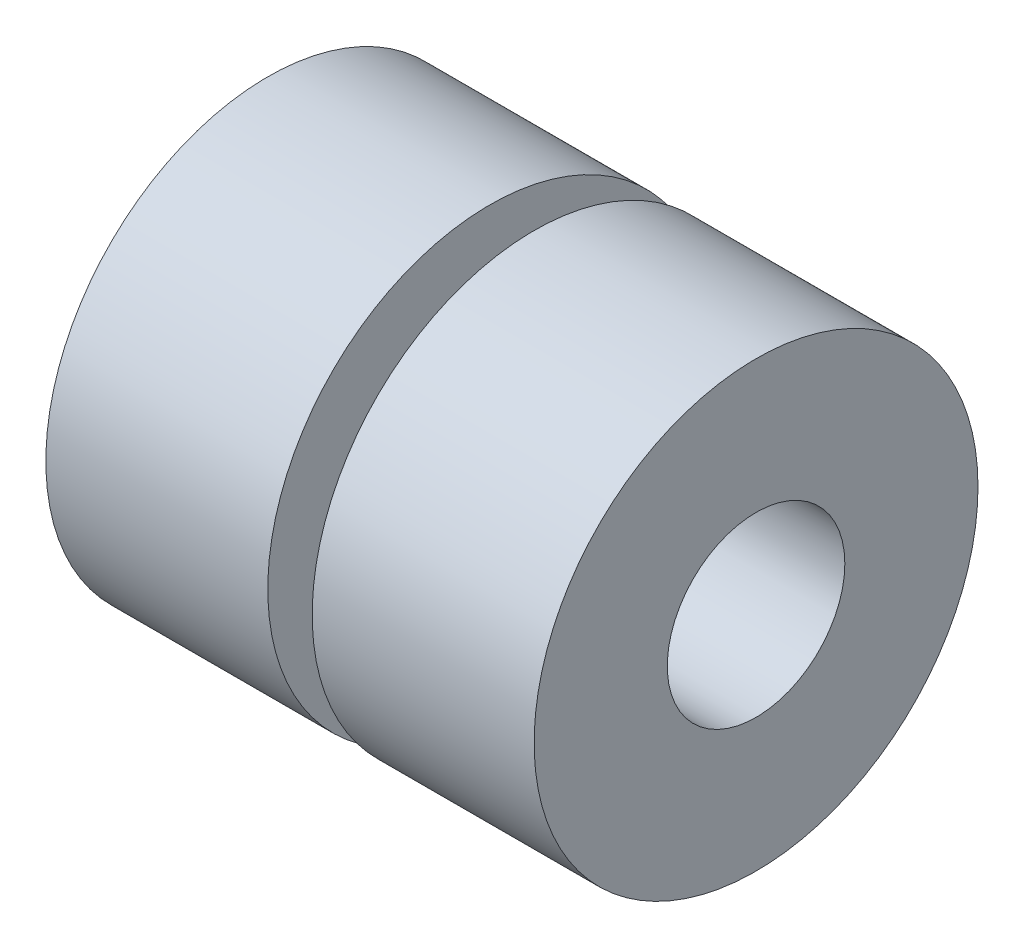
ISO-10303-21;
HEADER;
FILE_DESCRIPTION(('STEP AP214'),'2;1');
FILE_NAME('part.step','',(''),(''),'','','');
FILE_SCHEMA(('AUTOMOTIVE_DESIGN { 1 0 10303 214 1 1 1 1 }'));
ENDSEC;
DATA;
#1=APPLICATION_CONTEXT('core data for automotive mechanical design processes');
#2=APPLICATION_PROTOCOL_DEFINITION('international standard','automotive_design',2000,#1);
#3=PRODUCT_CONTEXT('',#1,'mechanical');
#4=PRODUCT('Part','Part','',(#3));
#5=PRODUCT_RELATED_PRODUCT_CATEGORY('part','',(#4));
#6=PRODUCT_DEFINITION_FORMATION('','',#4);
#7=PRODUCT_DEFINITION_CONTEXT('part definition',#1,'design');
#8=PRODUCT_DEFINITION('design','',#6,#7);
#9=PRODUCT_DEFINITION_SHAPE('','',#8);
#10=(LENGTH_UNIT() NAMED_UNIT(*) SI_UNIT(.MILLI.,.METRE.));
#11=(NAMED_UNIT(*) PLANE_ANGLE_UNIT() SI_UNIT($,.RADIAN.));
#12=(NAMED_UNIT(*) SI_UNIT($,.STERADIAN.) SOLID_ANGLE_UNIT());
#13=UNCERTAINTY_MEASURE_WITH_UNIT(LENGTH_MEASURE(1.E-05),#10,'distance_accuracy_value','');
#14=(GEOMETRIC_REPRESENTATION_CONTEXT(3) GLOBAL_UNCERTAINTY_ASSIGNED_CONTEXT((#13)) GLOBAL_UNIT_ASSIGNED_CONTEXT((#10,
#11,#12)) REPRESENTATION_CONTEXT('',''));
#15=CARTESIAN_POINT('',(0.,0.,0.));
#16=DIRECTION('',(0.,0.,1.));
#17=DIRECTION('',(1.,0.,0.));
#18=AXIS2_PLACEMENT_3D('',#15,#16,#17);
#19=CARTESIAN_POINT('',(5.,0.,0.));
#20=DIRECTION('',(-1.,0.,0.));
#21=DIRECTION('',(0.,0.,1.));
#22=AXIS2_PLACEMENT_3D('',#19,#20,#21);
#23=CYLINDRICAL_SURFACE('',#22,5.);
#24=CARTESIAN_POINT('',(5.,0.,0.));
#25=DIRECTION('',(1.,0.,0.));
#26=DIRECTION('',(0.,0.,-1.));
#27=AXIS2_PLACEMENT_3D('',#24,#25,#26);
#28=CIRCLE('',#27,5.);
#29=CARTESIAN_POINT('',(5.,0.,-5.));
#30=VERTEX_POINT('',#29);
#31=EDGE_CURVE('E10',#30,#30,#28,.T.);
#32=ORIENTED_EDGE('',*,*,#31,.F.);
#33=EDGE_LOOP('',(#32));
#34=FACE_BOUND('',#33,.T.);
#35=CARTESIAN_POINT('',(0.,0.,0.));
#36=DIRECTION('',(1.,0.,0.));
#37=DIRECTION('',(0.,0.,-1.));
#38=AXIS2_PLACEMENT_3D('',#35,#36,#37);
#39=CIRCLE('',#38,5.);
#40=CARTESIAN_POINT('',(0.,0.,-5.));
#41=VERTEX_POINT('',#40);
#42=EDGE_CURVE('E33',#41,#41,#39,.T.);
#43=ORIENTED_EDGE('',*,*,#42,.T.);
#44=EDGE_LOOP('',(#43));
#45=FACE_BOUND('',#44,.T.);
#46=ADVANCED_FACE('F30',(#34,#45),#23,.T.);
#47=CARTESIAN_POINT('',(5.,0.,0.));
#48=DIRECTION('',(1.,0.,0.));
#49=DIRECTION('',(0.,0.,-1.));
#50=AXIS2_PLACEMENT_3D('',#47,#48,#49);
#51=PLANE('',#50);
#52=CARTESIAN_POINT('',(5.,0.,0.));
#53=DIRECTION('',(1.,0.,0.));
#54=DIRECTION('',(0.,0.,-1.));
#55=AXIS2_PLACEMENT_3D('',#52,#53,#54);
#56=CIRCLE('',#55,2.5);
#57=CARTESIAN_POINT('',(5.,0.,-2.5));
#58=VERTEX_POINT('',#57);
#59=EDGE_CURVE('E42',#58,#58,#56,.T.);
#60=ORIENTED_EDGE('',*,*,#59,.F.);
#61=EDGE_LOOP('',(#60));
#62=FACE_BOUND('',#61,.T.);
#63=ORIENTED_EDGE('',*,*,#31,.T.);
#64=EDGE_LOOP('',(#63));
#65=FACE_BOUND('',#64,.T.);
#66=ADVANCED_FACE('F85',(#62,#65),#51,.T.);
#67=CARTESIAN_POINT('',(0.,0.,0.));
#68=DIRECTION('',(1.,0.,0.));
#69=DIRECTION('',(0.,0.,-1.));
#70=AXIS2_PLACEMENT_3D('',#67,#68,#69);
#71=PLANE('',#70);
#72=CARTESIAN_POINT('',(0.,0.,0.));
#73=DIRECTION('',(1.,0.,0.));
#74=DIRECTION('',(0.,0.,-1.));
#75=AXIS2_PLACEMENT_3D('',#72,#73,#74);
#76=CIRCLE('',#75,2.);
#77=CARTESIAN_POINT('',(0.,0.,-2.));
#78=VERTEX_POINT('',#77);
#79=EDGE_CURVE('E51',#78,#78,#76,.T.);
#80=ORIENTED_EDGE('',*,*,#79,.T.);
#81=EDGE_LOOP('',(#80));
#82=FACE_BOUND('',#81,.T.);
#83=ORIENTED_EDGE('',*,*,#42,.F.);
#84=EDGE_LOOP('',(#83));
#85=FACE_BOUND('',#84,.T.);
#86=ADVANCED_FACE('F90',(#82,#85),#71,.F.);
#87=CARTESIAN_POINT('',(6.,0.,0.));
#88=DIRECTION('',(-1.,0.,0.));
#89=DIRECTION('',(0.,0.,1.));
#90=AXIS2_PLACEMENT_3D('',#87,#88,#89);
#91=CYLINDRICAL_SURFACE('',#90,2.5);
#92=CARTESIAN_POINT('',(6.,0.,0.));
#93=DIRECTION('',(1.,0.,0.));
#94=DIRECTION('',(0.,0.,-1.));
#95=AXIS2_PLACEMENT_3D('',#92,#93,#94);
#96=CIRCLE('',#95,2.5);
#97=CARTESIAN_POINT('',(6.,0.,-2.5));
#98=VERTEX_POINT('',#97);
#99=EDGE_CURVE('E40',#98,#98,#96,.T.);
#100=ORIENTED_EDGE('',*,*,#99,.F.);
#101=EDGE_LOOP('',(#100));
#102=FACE_BOUND('',#101,.T.);
#103=ORIENTED_EDGE('',*,*,#59,.T.);
#104=EDGE_LOOP('',(#103));
#105=FACE_BOUND('',#104,.T.);
#106=ADVANCED_FACE('F73',(#102,#105),#91,.T.);
#107=CARTESIAN_POINT('',(11.,0.,0.));
#108=DIRECTION('',(-1.,0.,0.));
#109=DIRECTION('',(0.,0.,1.));
#110=AXIS2_PLACEMENT_3D('',#107,#108,#109);
#111=CYLINDRICAL_SURFACE('',#110,5.);
#112=CARTESIAN_POINT('',(11.,0.,0.));
#113=DIRECTION('',(1.,0.,0.));
#114=DIRECTION('',(0.,0.,-1.));
#115=AXIS2_PLACEMENT_3D('',#112,#113,#114);
#116=CIRCLE('',#115,5.);
#117=CARTESIAN_POINT('',(11.,0.,-5.));
#118=VERTEX_POINT('',#117);
#119=EDGE_CURVE('E45',#118,#118,#116,.T.);
#120=ORIENTED_EDGE('',*,*,#119,.F.);
#121=EDGE_LOOP('',(#120));
#122=FACE_BOUND('',#121,.T.);
#123=CARTESIAN_POINT('',(6.,0.,0.));
#124=DIRECTION('',(1.,0.,0.));
#125=DIRECTION('',(0.,0.,-1.));
#126=AXIS2_PLACEMENT_3D('',#123,#124,#125);
#127=CIRCLE('',#126,5.);
#128=CARTESIAN_POINT('',(6.,0.,-5.));
#129=VERTEX_POINT('',#128);
#130=EDGE_CURVE('E48',#129,#129,#127,.T.);
#131=ORIENTED_EDGE('',*,*,#130,.T.);
#132=EDGE_LOOP('',(#131));
#133=FACE_BOUND('',#132,.T.);
#134=ADVANCED_FACE('F67',(#122,#133),#111,.T.);
#135=CARTESIAN_POINT('',(11.,0.,0.));
#136=DIRECTION('',(1.,0.,0.));
#137=DIRECTION('',(0.,0.,-1.));
#138=AXIS2_PLACEMENT_3D('',#135,#136,#137);
#139=PLANE('',#138);
#140=CARTESIAN_POINT('',(11.,0.,0.));
#141=DIRECTION('',(1.,0.,0.));
#142=DIRECTION('',(0.,0.,-1.));
#143=AXIS2_PLACEMENT_3D('',#140,#141,#142);
#144=CIRCLE('',#143,2.);
#145=CARTESIAN_POINT('',(11.,0.,-2.));
#146=VERTEX_POINT('',#145);
#147=EDGE_CURVE('E56',#146,#146,#144,.T.);
#148=ORIENTED_EDGE('',*,*,#147,.F.);
#149=EDGE_LOOP('',(#148));
#150=FACE_BOUND('',#149,.T.);
#151=ORIENTED_EDGE('',*,*,#119,.T.);
#152=EDGE_LOOP('',(#151));
#153=FACE_BOUND('',#152,.T.);
#154=ADVANCED_FACE('F63',(#150,#153),#139,.T.);
#155=CARTESIAN_POINT('',(6.,0.,0.));
#156=DIRECTION('',(1.,0.,0.));
#157=DIRECTION('',(0.,0.,-1.));
#158=AXIS2_PLACEMENT_3D('',#155,#156,#157);
#159=PLANE('',#158);
#160=ORIENTED_EDGE('',*,*,#99,.T.);
#161=EDGE_LOOP('',(#160));
#162=FACE_BOUND('',#161,.T.);
#163=ORIENTED_EDGE('',*,*,#130,.F.);
#164=EDGE_LOOP('',(#163));
#165=FACE_BOUND('',#164,.T.);
#166=ADVANCED_FACE('F66',(#162,#165),#159,.F.);
#167=CARTESIAN_POINT('',(-5.,0.,0.));
#168=DIRECTION('',(1.,0.,0.));
#169=DIRECTION('',(0.,0.,-1.));
#170=AXIS2_PLACEMENT_3D('',#167,#168,#169);
#171=CYLINDRICAL_SURFACE('',#170,2.);
#172=ORIENTED_EDGE('',*,*,#147,.T.);
#173=EDGE_LOOP('',(#172));
#174=FACE_BOUND('',#173,.T.);
#175=ORIENTED_EDGE('',*,*,#79,.F.);
#176=EDGE_LOOP('',(#175));
#177=FACE_BOUND('',#176,.T.);
#178=ADVANCED_FACE('F60',(#174,#177),#171,.F.);
#179=CLOSED_SHELL('',(#46,#66,#86,#106,#134,#154,#166,#178));
#180=MANIFOLD_SOLID_BREP('B2',#179);
#181=ADVANCED_BREP_SHAPE_REPRESENTATION('',(#18,#180),#14);
#182=SHAPE_DEFINITION_REPRESENTATION(#9,#181);
ENDSEC;
END-ISO-10303-21;
